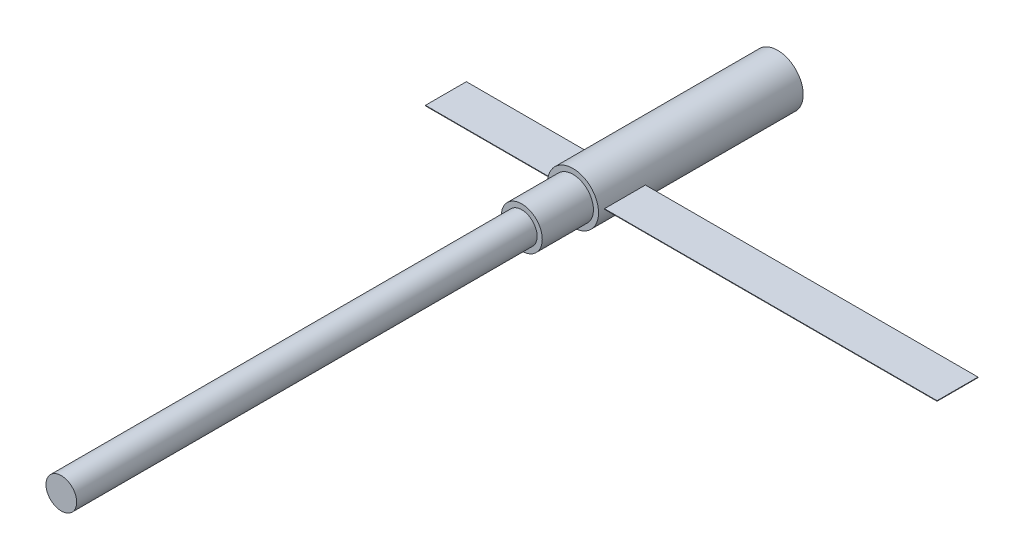
ISO-10303-21;
HEADER;
FILE_DESCRIPTION(('STEP AP214'),'2;1');
FILE_NAME('part.step','',(''),(''),'','','');
FILE_SCHEMA(('AUTOMOTIVE_DESIGN { 1 0 10303 214 1 1 1 1 }'));
ENDSEC;
DATA;
#1=APPLICATION_CONTEXT('core data for automotive mechanical design processes');
#2=APPLICATION_PROTOCOL_DEFINITION('international standard','automotive_design',2000,#1);
#3=PRODUCT_CONTEXT('',#1,'mechanical');
#4=PRODUCT('Part','Part','',(#3));
#5=PRODUCT_RELATED_PRODUCT_CATEGORY('part','',(#4));
#6=PRODUCT_DEFINITION_FORMATION('','',#4);
#7=PRODUCT_DEFINITION_CONTEXT('part definition',#1,'design');
#8=PRODUCT_DEFINITION('design','',#6,#7);
#9=PRODUCT_DEFINITION_SHAPE('','',#8);
#10=(LENGTH_UNIT() NAMED_UNIT(*) SI_UNIT(.MILLI.,.METRE.));
#11=(NAMED_UNIT(*) PLANE_ANGLE_UNIT() SI_UNIT($,.RADIAN.));
#12=(NAMED_UNIT(*) SI_UNIT($,.STERADIAN.) SOLID_ANGLE_UNIT());
#13=UNCERTAINTY_MEASURE_WITH_UNIT(LENGTH_MEASURE(1.E-05),#10,'distance_accuracy_value','');
#14=(GEOMETRIC_REPRESENTATION_CONTEXT(3) GLOBAL_UNCERTAINTY_ASSIGNED_CONTEXT((#13)) GLOBAL_UNIT_ASSIGNED_CONTEXT((#10,
#11,#12)) REPRESENTATION_CONTEXT('',''));
#15=CARTESIAN_POINT('',(0.,0.,0.));
#16=DIRECTION('',(0.,0.,1.));
#17=DIRECTION('',(1.,0.,0.));
#18=AXIS2_PLACEMENT_3D('',#15,#16,#17);
#19=CARTESIAN_POINT('',(7000.,10.,3083.47817768516));
#20=DIRECTION('',(1.,0.,0.));
#21=DIRECTION('',(0.,0.,-1.));
#22=AXIS2_PLACEMENT_3D('',#19,#20,#21);
#23=PLANE('',#22);
#24=DIRECTION('',(0.,0.,1.));
#25=VECTOR('',#24,1.);
#26=CARTESIAN_POINT('',(7000.,0.,3083.47817768516));
#27=LINE('',#26,#25);
#28=CARTESIAN_POINT('',(7000.,0.,3083.47817768516));
#29=VERTEX_POINT('',#28);
#30=CARTESIAN_POINT('',(7000.,0.,3883.47817768516));
#31=VERTEX_POINT('',#30);
#32=EDGE_CURVE('E114',#29,#31,#27,.T.);
#33=ORIENTED_EDGE('',*,*,#32,.F.);
#34=DIRECTION('',(0.,-1.,0.));
#35=VECTOR('',#34,1.);
#36=CARTESIAN_POINT('',(7000.,10.,3083.47817768516));
#37=LINE('',#36,#35);
#38=CARTESIAN_POINT('',(7000.,10.,3083.47817768516));
#39=VERTEX_POINT('',#38);
#40=EDGE_CURVE('E12',#39,#29,#37,.T.);
#41=ORIENTED_EDGE('',*,*,#40,.F.);
#42=DIRECTION('',(0.,0.,1.));
#43=VECTOR('',#42,1.);
#44=CARTESIAN_POINT('',(7000.,10.,3083.47817768516));
#45=LINE('',#44,#43);
#46=CARTESIAN_POINT('',(7000.,10.,3883.47817768516));
#47=VERTEX_POINT('',#46);
#48=EDGE_CURVE('E109',#39,#47,#45,.T.);
#49=ORIENTED_EDGE('',*,*,#48,.T.);
#50=DIRECTION('',(0.,-1.,0.));
#51=VECTOR('',#50,1.);
#52=CARTESIAN_POINT('',(7000.,10.,3883.47817768516));
#53=LINE('',#52,#51);
#54=EDGE_CURVE('E52',#47,#31,#53,.T.);
#55=ORIENTED_EDGE('',*,*,#54,.T.);
#56=EDGE_LOOP('',(#33,#41,#49,#55));
#57=FACE_BOUND('',#56,.T.);
#58=ADVANCED_FACE('F49',(#57),#23,.T.);
#59=CARTESIAN_POINT('',(7000.,10.,3083.47817768516));
#60=DIRECTION('',(0.,0.,1.));
#61=DIRECTION('',(1.,0.,0.));
#62=AXIS2_PLACEMENT_3D('',#59,#60,#61);
#63=PLANE('',#62);
#64=DIRECTION('',(-1.,0.,0.));
#65=VECTOR('',#64,1.);
#66=CARTESIAN_POINT('',(7000.,0.,3083.47817768516));
#67=LINE('',#66,#65);
#68=CARTESIAN_POINT('',(-3000.,0.,3083.47817768517));
#69=VERTEX_POINT('',#68);
#70=EDGE_CURVE('E82',#29,#69,#67,.T.);
#71=ORIENTED_EDGE('',*,*,#70,.T.);
#72=DIRECTION('',(0.,-1.,0.));
#73=VECTOR('',#72,1.);
#74=CARTESIAN_POINT('',(-3000.,10.,3083.47817768517));
#75=LINE('',#74,#73);
#76=CARTESIAN_POINT('',(-3000.,10.,3083.47817768517));
#77=VERTEX_POINT('',#76);
#78=EDGE_CURVE('E58',#77,#69,#75,.T.);
#79=ORIENTED_EDGE('',*,*,#78,.F.);
#80=DIRECTION('',(-1.,0.,0.));
#81=VECTOR('',#80,1.);
#82=CARTESIAN_POINT('',(7000.,10.,3083.47817768516));
#83=LINE('',#82,#81);
#84=EDGE_CURVE('E99',#39,#77,#83,.T.);
#85=ORIENTED_EDGE('',*,*,#84,.F.);
#86=ORIENTED_EDGE('',*,*,#40,.T.);
#87=EDGE_LOOP('',(#71,#79,#85,#86));
#88=FACE_BOUND('',#87,.T.);
#89=ADVANCED_FACE('F124',(#88),#63,.F.);
#90=CARTESIAN_POINT('',(-3000.,10.,3083.47817768517));
#91=DIRECTION('',(1.,0.,0.));
#92=DIRECTION('',(0.,0.,-1.));
#93=AXIS2_PLACEMENT_3D('',#90,#91,#92);
#94=PLANE('',#93);
#95=DIRECTION('',(0.,0.,1.));
#96=VECTOR('',#95,1.);
#97=CARTESIAN_POINT('',(-3000.,0.,3083.47817768517));
#98=LINE('',#97,#96);
#99=CARTESIAN_POINT('',(-3000.,0.,3883.47817768517));
#100=VERTEX_POINT('',#99);
#101=EDGE_CURVE('E106',#69,#100,#98,.T.);
#102=ORIENTED_EDGE('',*,*,#101,.T.);
#103=DIRECTION('',(0.,-1.,0.));
#104=VECTOR('',#103,1.);
#105=CARTESIAN_POINT('',(-3000.,10.,3883.47817768517));
#106=LINE('',#105,#104);
#107=CARTESIAN_POINT('',(-3000.,10.,3883.47817768517));
#108=VERTEX_POINT('',#107);
#109=EDGE_CURVE('E103',#108,#100,#106,.T.);
#110=ORIENTED_EDGE('',*,*,#109,.F.);
#111=DIRECTION('',(0.,0.,1.));
#112=VECTOR('',#111,1.);
#113=CARTESIAN_POINT('',(-3000.,10.,3083.47817768517));
#114=LINE('',#113,#112);
#115=EDGE_CURVE('E94',#77,#108,#114,.T.);
#116=ORIENTED_EDGE('',*,*,#115,.F.);
#117=ORIENTED_EDGE('',*,*,#78,.T.);
#118=EDGE_LOOP('',(#102,#110,#116,#117));
#119=FACE_BOUND('',#118,.T.);
#120=ADVANCED_FACE('F104',(#119),#94,.F.);
#121=CARTESIAN_POINT('',(7000.,10.,3883.47817768516));
#122=DIRECTION('',(0.,0.,1.));
#123=DIRECTION('',(1.,0.,0.));
#124=AXIS2_PLACEMENT_3D('',#121,#122,#123);
#125=PLANE('',#124);
#126=DIRECTION('',(-1.,0.,0.));
#127=VECTOR('',#126,1.);
#128=CARTESIAN_POINT('',(7000.,0.,3883.47817768516));
#129=LINE('',#128,#127);
#130=EDGE_CURVE('E117',#31,#100,#129,.T.);
#131=ORIENTED_EDGE('',*,*,#130,.F.);
#132=ORIENTED_EDGE('',*,*,#54,.F.);
#133=DIRECTION('',(-1.,0.,0.));
#134=VECTOR('',#133,1.);
#135=CARTESIAN_POINT('',(7000.,10.,3883.47817768516));
#136=LINE('',#135,#134);
#137=EDGE_CURVE('E98',#47,#108,#136,.T.);
#138=ORIENTED_EDGE('',*,*,#137,.T.);
#139=ORIENTED_EDGE('',*,*,#109,.T.);
#140=EDGE_LOOP('',(#131,#132,#138,#139));
#141=FACE_BOUND('',#140,.T.);
#142=ADVANCED_FACE('F108',(#141),#125,.T.);
#143=CARTESIAN_POINT('',(0.,10.,2583.47817768517));
#144=DIRECTION('',(0.,-1.,0.));
#145=DIRECTION('',(0.,0.,-1.));
#146=AXIS2_PLACEMENT_3D('',#143,#144,#145);
#147=PLANE('',#146);
#148=ORIENTED_EDGE('',*,*,#48,.F.);
#149=ORIENTED_EDGE('',*,*,#84,.T.);
#150=ORIENTED_EDGE('',*,*,#115,.T.);
#151=ORIENTED_EDGE('',*,*,#137,.F.);
#152=EDGE_LOOP('',(#148,#149,#150,#151));
#153=FACE_BOUND('',#152,.T.);
#154=ADVANCED_FACE('F97',(#153),#147,.F.);
#155=CARTESIAN_POINT('',(0.,0.,2583.47817768517));
#156=DIRECTION('',(0.,-1.,0.));
#157=DIRECTION('',(0.,0.,-1.));
#158=AXIS2_PLACEMENT_3D('',#155,#156,#157);
#159=PLANE('',#158);
#160=ORIENTED_EDGE('',*,*,#32,.T.);
#161=ORIENTED_EDGE('',*,*,#130,.T.);
#162=ORIENTED_EDGE('',*,*,#101,.F.);
#163=ORIENTED_EDGE('',*,*,#70,.F.);
#164=EDGE_LOOP('',(#160,#161,#162,#163));
#165=FACE_BOUND('',#164,.T.);
#166=ADVANCED_FACE('F122',(#165),#159,.T.);
#167=CLOSED_SHELL('',(#58,#89,#120,#142,#154,#166));
#168=MANIFOLD_SOLID_BREP('B2',#167);
#169=CARTESIAN_POINT('',(0.,0.,4000.));
#170=DIRECTION('',(0.,0.,-1.));
#171=DIRECTION('',(-1.,0.,0.));
#172=AXIS2_PLACEMENT_3D('',#169,#170,#171);
#173=CYLINDRICAL_SURFACE('',#172,500.);
#174=CARTESIAN_POINT('',(0.,0.,4000.));
#175=DIRECTION('',(0.,0.,1.));
#176=DIRECTION('',(1.,0.,0.));
#177=AXIS2_PLACEMENT_3D('',#174,#175,#176);
#178=CIRCLE('',#177,500.);
#179=CARTESIAN_POINT('',(500.,0.,4000.));
#180=VERTEX_POINT('',#179);
#181=EDGE_CURVE('E48',#180,#180,#178,.T.);
#182=ORIENTED_EDGE('',*,*,#181,.F.);
#183=EDGE_LOOP('',(#182));
#184=FACE_BOUND('',#183,.T.);
#185=CARTESIAN_POINT('',(0.,0.,0.));
#186=DIRECTION('',(0.,0.,1.));
#187=DIRECTION('',(1.,0.,0.));
#188=AXIS2_PLACEMENT_3D('',#185,#186,#187);
#189=CIRCLE('',#188,500.);
#190=CARTESIAN_POINT('',(500.,0.,0.));
#191=VERTEX_POINT('',#190);
#192=EDGE_CURVE('E204',#191,#191,#189,.T.);
#193=ORIENTED_EDGE('',*,*,#192,.T.);
#194=EDGE_LOOP('',(#193));
#195=FACE_BOUND('',#194,.T.);
#196=ADVANCED_FACE('F197',(#184,#195),#173,.T.);
#197=CARTESIAN_POINT('',(0.,0.,4000.));
#198=DIRECTION('',(0.,0.,1.));
#199=DIRECTION('',(1.,0.,0.));
#200=AXIS2_PLACEMENT_3D('',#197,#198,#199);
#201=PLANE('',#200);
#202=CARTESIAN_POINT('',(0.,0.,4000.));
#203=DIRECTION('',(0.,0.,1.));
#204=DIRECTION('',(1.,0.,0.));
#205=AXIS2_PLACEMENT_3D('',#202,#203,#204);
#206=CIRCLE('',#205,400.);
#207=CARTESIAN_POINT('',(400.,0.,4000.));
#208=VERTEX_POINT('',#207);
#209=EDGE_CURVE('E213',#208,#208,#206,.T.);
#210=ORIENTED_EDGE('',*,*,#209,.F.);
#211=EDGE_LOOP('',(#210));
#212=FACE_BOUND('',#211,.T.);
#213=ORIENTED_EDGE('',*,*,#181,.T.);
#214=EDGE_LOOP('',(#213));
#215=FACE_BOUND('',#214,.T.);
#216=ADVANCED_FACE('F241',(#212,#215),#201,.T.);
#217=CARTESIAN_POINT('',(0.,0.,0.));
#218=DIRECTION('',(0.,0.,1.));
#219=DIRECTION('',(1.,0.,0.));
#220=AXIS2_PLACEMENT_3D('',#217,#218,#219);
#221=PLANE('',#220);
#222=ORIENTED_EDGE('',*,*,#192,.F.);
#223=EDGE_LOOP('',(#222));
#224=FACE_BOUND('',#223,.T.);
#225=ADVANCED_FACE('F237',(#224),#221,.F.);
#226=CARTESIAN_POINT('',(0.,0.,5000.));
#227=DIRECTION('',(0.,0.,-1.));
#228=DIRECTION('',(-1.,0.,0.));
#229=AXIS2_PLACEMENT_3D('',#226,#227,#228);
#230=CYLINDRICAL_SURFACE('',#229,400.);
#231=CARTESIAN_POINT('',(0.,0.,5000.));
#232=DIRECTION('',(0.,0.,1.));
#233=DIRECTION('',(1.,0.,0.));
#234=AXIS2_PLACEMENT_3D('',#231,#232,#233);
#235=CIRCLE('',#234,400.);
#236=CARTESIAN_POINT('',(400.,0.,5000.));
#237=VERTEX_POINT('',#236);
#238=EDGE_CURVE('E216',#237,#237,#235,.T.);
#239=ORIENTED_EDGE('',*,*,#238,.F.);
#240=EDGE_LOOP('',(#239));
#241=FACE_BOUND('',#240,.T.);
#242=ORIENTED_EDGE('',*,*,#209,.T.);
#243=EDGE_LOOP('',(#242));
#244=FACE_BOUND('',#243,.T.);
#245=ADVANCED_FACE('F229',(#241,#244),#230,.T.);
#246=CARTESIAN_POINT('',(0.,0.,5000.));
#247=DIRECTION('',(0.,0.,1.));
#248=DIRECTION('',(1.,0.,0.));
#249=AXIS2_PLACEMENT_3D('',#246,#247,#248);
#250=PLANE('',#249);
#251=CARTESIAN_POINT('',(0.,0.,5000.));
#252=DIRECTION('',(0.,0.,1.));
#253=DIRECTION('',(1.,0.,0.));
#254=AXIS2_PLACEMENT_3D('',#251,#252,#253);
#255=CIRCLE('',#254,300.);
#256=CARTESIAN_POINT('',(300.,0.,5000.));
#257=VERTEX_POINT('',#256);
#258=EDGE_CURVE('E200',#257,#257,#255,.T.);
#259=ORIENTED_EDGE('',*,*,#258,.F.);
#260=EDGE_LOOP('',(#259));
#261=FACE_BOUND('',#260,.T.);
#262=ORIENTED_EDGE('',*,*,#238,.T.);
#263=EDGE_LOOP('',(#262));
#264=FACE_BOUND('',#263,.T.);
#265=ADVANCED_FACE('F226',(#261,#264),#250,.T.);
#266=CARTESIAN_POINT('',(0.,0.,14000.));
#267=DIRECTION('',(0.,0.,1.));
#268=DIRECTION('',(1.,0.,0.));
#269=AXIS2_PLACEMENT_3D('',#266,#267,#268);
#270=PLANE('',#269);
#271=CARTESIAN_POINT('',(0.,0.,14000.));
#272=DIRECTION('',(0.,0.,1.));
#273=DIRECTION('',(1.,0.,0.));
#274=AXIS2_PLACEMENT_3D('',#271,#272,#273);
#275=CIRCLE('',#274,300.);
#276=CARTESIAN_POINT('',(300.,0.,14000.));
#277=VERTEX_POINT('',#276);
#278=EDGE_CURVE('E209',#277,#277,#275,.T.);
#279=ORIENTED_EDGE('',*,*,#278,.T.);
#280=EDGE_LOOP('',(#279));
#281=FACE_BOUND('',#280,.T.);
#282=ADVANCED_FACE('F228',(#281),#270,.T.);
#283=CARTESIAN_POINT('',(0.,0.,14000.));
#284=DIRECTION('',(0.,0.,-1.));
#285=DIRECTION('',(-1.,0.,0.));
#286=AXIS2_PLACEMENT_3D('',#283,#284,#285);
#287=CYLINDRICAL_SURFACE('',#286,300.);
#288=ORIENTED_EDGE('',*,*,#258,.T.);
#289=EDGE_LOOP('',(#288));
#290=FACE_BOUND('',#289,.T.);
#291=ORIENTED_EDGE('',*,*,#278,.F.);
#292=EDGE_LOOP('',(#291));
#293=FACE_BOUND('',#292,.T.);
#294=ADVANCED_FACE('F223',(#290,#293),#287,.T.);
#295=CLOSED_SHELL('',(#196,#216,#225,#245,#265,#282,#294));
#296=MANIFOLD_SOLID_BREP('B6',#295);
#297=ADVANCED_BREP_SHAPE_REPRESENTATION('',(#18,#168,#296),#14);
#298=SHAPE_DEFINITION_REPRESENTATION(#9,#297);
ENDSEC;
END-ISO-10303-21;
